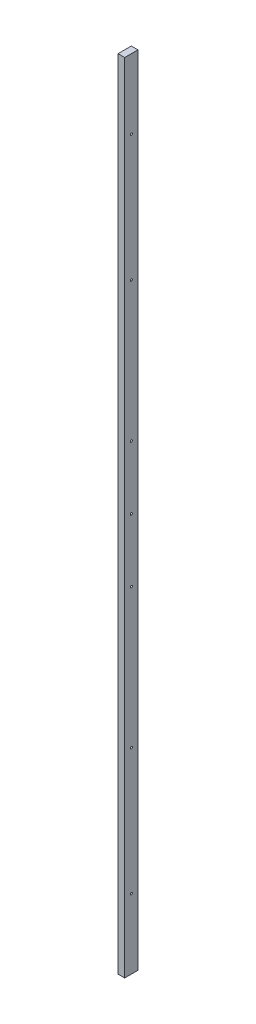
ISO-10303-21;
HEADER;
FILE_DESCRIPTION(('STEP AP214'),'2;1');
FILE_NAME('part.step','',(''),(''),'','','');
FILE_SCHEMA(('AUTOMOTIVE_DESIGN { 1 0 10303 214 1 1 1 1 }'));
ENDSEC;
DATA;
#1=APPLICATION_CONTEXT('core data for automotive mechanical design processes');
#2=APPLICATION_PROTOCOL_DEFINITION('international standard','automotive_design',2000,#1);
#3=PRODUCT_CONTEXT('',#1,'mechanical');
#4=PRODUCT('Part','Part','',(#3));
#5=PRODUCT_RELATED_PRODUCT_CATEGORY('part','',(#4));
#6=PRODUCT_DEFINITION_FORMATION('','',#4);
#7=PRODUCT_DEFINITION_CONTEXT('part definition',#1,'design');
#8=PRODUCT_DEFINITION('design','',#6,#7);
#9=PRODUCT_DEFINITION_SHAPE('','',#8);
#10=(LENGTH_UNIT() NAMED_UNIT(*) SI_UNIT(.MILLI.,.METRE.));
#11=(NAMED_UNIT(*) PLANE_ANGLE_UNIT() SI_UNIT($,.RADIAN.));
#12=(NAMED_UNIT(*) SI_UNIT($,.STERADIAN.) SOLID_ANGLE_UNIT());
#13=UNCERTAINTY_MEASURE_WITH_UNIT(LENGTH_MEASURE(1.E-05),#10,'distance_accuracy_value','');
#14=(GEOMETRIC_REPRESENTATION_CONTEXT(3) GLOBAL_UNCERTAINTY_ASSIGNED_CONTEXT((#13)) GLOBAL_UNIT_ASSIGNED_CONTEXT((#10,
#11,#12)) REPRESENTATION_CONTEXT('',''));
#15=CARTESIAN_POINT('',(0.,0.,0.));
#16=DIRECTION('',(0.,0.,1.));
#17=DIRECTION('',(1.,0.,0.));
#18=AXIS2_PLACEMENT_3D('',#15,#16,#17);
#19=CARTESIAN_POINT('',(-12.5,3000.,-25.));
#20=DIRECTION('',(1.,0.,0.));
#21=DIRECTION('',(0.,0.,-1.));
#22=AXIS2_PLACEMENT_3D('',#19,#20,#21);
#23=PLANE('',#22);
#24=CARTESIAN_POINT('',(-12.5,1500.,0.));
#25=DIRECTION('',(-1.,0.,0.));
#26=DIRECTION('',(0.,0.,1.));
#27=AXIS2_PLACEMENT_3D('',#24,#25,#26);
#28=CIRCLE('',#27,4.);
#29=CARTESIAN_POINT('',(-12.5,1500.,4.));
#30=VERTEX_POINT('',#29);
#31=EDGE_CURVE('E203',#30,#30,#28,.T.);
#32=ORIENTED_EDGE('',*,*,#31,.F.);
#33=EDGE_LOOP('',(#32));
#34=FACE_BOUND('',#33,.T.);
#35=CARTESIAN_POINT('',(-12.5,1737.5,0.));
#36=DIRECTION('',(-1.,0.,0.));
#37=DIRECTION('',(0.,0.,1.));
#38=AXIS2_PLACEMENT_3D('',#35,#36,#37);
#39=CIRCLE('',#38,4.);
#40=CARTESIAN_POINT('',(-12.5,1737.5,4.00000000000007));
#41=VERTEX_POINT('',#40);
#42=EDGE_CURVE('E138',#41,#41,#39,.T.);
#43=ORIENTED_EDGE('',*,*,#42,.F.);
#44=EDGE_LOOP('',(#43));
#45=FACE_BOUND('',#44,.T.);
#46=CARTESIAN_POINT('',(-12.5,1262.5,0.));
#47=DIRECTION('',(-1.,0.,0.));
#48=DIRECTION('',(0.,0.,1.));
#49=AXIS2_PLACEMENT_3D('',#46,#47,#48);
#50=CIRCLE('',#49,4.);
#51=CARTESIAN_POINT('',(-12.5,1262.5,4.));
#52=VERTEX_POINT('',#51);
#53=EDGE_CURVE('E150',#52,#52,#50,.T.);
#54=ORIENTED_EDGE('',*,*,#53,.F.);
#55=EDGE_LOOP('',(#54));
#56=FACE_BOUND('',#55,.T.);
#57=CARTESIAN_POINT('',(-12.5,2262.5,0.));
#58=DIRECTION('',(-1.,0.,0.));
#59=DIRECTION('',(0.,0.,1.));
#60=AXIS2_PLACEMENT_3D('',#57,#58,#59);
#61=CIRCLE('',#60,4.);
#62=CARTESIAN_POINT('',(-12.5,2262.5,4.00000000000006));
#63=VERTEX_POINT('',#62);
#64=EDGE_CURVE('E133',#63,#63,#61,.T.);
#65=ORIENTED_EDGE('',*,*,#64,.F.);
#66=EDGE_LOOP('',(#65));
#67=FACE_BOUND('',#66,.T.);
#68=CARTESIAN_POINT('',(-12.5000000000002,2737.5,0.));
#69=DIRECTION('',(1.,0.,0.));
#70=DIRECTION('',(0.,0.,-1.));
#71=AXIS2_PLACEMENT_3D('',#68,#69,#70);
#72=CIRCLE('',#71,4.);
#73=CARTESIAN_POINT('',(-12.5000000000002,2737.5,-4.00000000000004));
#74=VERTEX_POINT('',#73);
#75=EDGE_CURVE('E117',#74,#74,#72,.T.);
#76=ORIENTED_EDGE('',*,*,#75,.T.);
#77=EDGE_LOOP('',(#76));
#78=FACE_BOUND('',#77,.T.);
#79=CARTESIAN_POINT('',(-12.5000000000002,262.5,0.));
#80=DIRECTION('',(1.,0.,0.));
#81=DIRECTION('',(0.,0.,-1.));
#82=AXIS2_PLACEMENT_3D('',#79,#80,#81);
#83=CIRCLE('',#82,4.);
#84=CARTESIAN_POINT('',(-12.5000000000002,262.5,-4.));
#85=VERTEX_POINT('',#84);
#86=EDGE_CURVE('E167',#85,#85,#83,.T.);
#87=ORIENTED_EDGE('',*,*,#86,.T.);
#88=EDGE_LOOP('',(#87));
#89=FACE_BOUND('',#88,.T.);
#90=CARTESIAN_POINT('',(-12.5000000000002,737.5,0.));
#91=DIRECTION('',(1.,0.,0.));
#92=DIRECTION('',(0.,0.,-1.));
#93=AXIS2_PLACEMENT_3D('',#90,#91,#92);
#94=CIRCLE('',#93,4.);
#95=CARTESIAN_POINT('',(-12.5000000000002,737.5,-4.));
#96=VERTEX_POINT('',#95);
#97=EDGE_CURVE('E156',#96,#96,#94,.T.);
#98=ORIENTED_EDGE('',*,*,#97,.T.);
#99=EDGE_LOOP('',(#98));
#100=FACE_BOUND('',#99,.T.);
#101=DIRECTION('',(0.,0.,1.));
#102=VECTOR('',#101,1.);
#103=CARTESIAN_POINT('',(-12.5,0.,-25.));
#104=LINE('',#103,#102);
#105=CARTESIAN_POINT('',(-12.5,0.,-25.));
#106=VERTEX_POINT('',#105);
#107=CARTESIAN_POINT('',(-12.5,0.,25.));
#108=VERTEX_POINT('',#107);
#109=EDGE_CURVE('E113',#106,#108,#104,.T.);
#110=ORIENTED_EDGE('',*,*,#109,.T.);
#111=DIRECTION('',(0.,-1.,0.));
#112=VECTOR('',#111,1.);
#113=CARTESIAN_POINT('',(-12.5,3000.,25.));
#114=LINE('',#113,#112);
#115=CARTESIAN_POINT('',(-12.5,3000.,25.));
#116=VERTEX_POINT('',#115);
#117=EDGE_CURVE('E11',#116,#108,#114,.T.);
#118=ORIENTED_EDGE('',*,*,#117,.F.);
#119=DIRECTION('',(0.,0.,1.));
#120=VECTOR('',#119,1.);
#121=CARTESIAN_POINT('',(-12.5,3000.,-25.));
#122=LINE('',#121,#120);
#123=CARTESIAN_POINT('',(-12.5,3000.,-25.));
#124=VERTEX_POINT('',#123);
#125=EDGE_CURVE('E96',#124,#116,#122,.T.);
#126=ORIENTED_EDGE('',*,*,#125,.F.);
#127=DIRECTION('',(0.,-1.,0.));
#128=VECTOR('',#127,1.);
#129=CARTESIAN_POINT('',(-12.5,3000.,-25.));
#130=LINE('',#129,#128);
#131=EDGE_CURVE('E109',#124,#106,#130,.T.);
#132=ORIENTED_EDGE('',*,*,#131,.T.);
#133=EDGE_LOOP('',(#110,#118,#126,#132));
#134=FACE_BOUND('',#133,.T.);
#135=ADVANCED_FACE('F42',(#34,#45,#56,#67,#78,#89,#100,#134),#23,.F.);
#136=CARTESIAN_POINT('',(12.5,3000.,25.));
#137=DIRECTION('',(0.,0.,-1.));
#138=DIRECTION('',(-1.,0.,0.));
#139=AXIS2_PLACEMENT_3D('',#136,#137,#138);
#140=PLANE('',#139);
#141=DIRECTION('',(1.,0.,0.));
#142=VECTOR('',#141,1.);
#143=CARTESIAN_POINT('',(12.5,0.,25.));
#144=LINE('',#143,#142);
#145=CARTESIAN_POINT('',(12.5,0.,25.));
#146=VERTEX_POINT('',#145);
#147=EDGE_CURVE('E101',#108,#146,#144,.T.);
#148=ORIENTED_EDGE('',*,*,#147,.T.);
#149=DIRECTION('',(0.,-1.,0.));
#150=VECTOR('',#149,1.);
#151=CARTESIAN_POINT('',(12.5,3000.,25.));
#152=LINE('',#151,#150);
#153=CARTESIAN_POINT('',(12.5,3000.,25.));
#154=VERTEX_POINT('',#153);
#155=EDGE_CURVE('E52',#154,#146,#152,.T.);
#156=ORIENTED_EDGE('',*,*,#155,.F.);
#157=DIRECTION('',(1.,0.,0.));
#158=VECTOR('',#157,1.);
#159=CARTESIAN_POINT('',(12.5,3000.,25.));
#160=LINE('',#159,#158);
#161=EDGE_CURVE('E91',#116,#154,#160,.T.);
#162=ORIENTED_EDGE('',*,*,#161,.F.);
#163=ORIENTED_EDGE('',*,*,#117,.T.);
#164=EDGE_LOOP('',(#148,#156,#162,#163));
#165=FACE_BOUND('',#164,.T.);
#166=ADVANCED_FACE('F100',(#165),#140,.F.);
#167=CARTESIAN_POINT('',(12.5,3000.,-25.));
#168=DIRECTION('',(-1.,0.,0.));
#169=DIRECTION('',(0.,0.,1.));
#170=AXIS2_PLACEMENT_3D('',#167,#168,#169);
#171=PLANE('',#170);
#172=CARTESIAN_POINT('',(12.5,1500.,0.));
#173=DIRECTION('',(-1.,0.,0.));
#174=DIRECTION('',(0.,0.,1.));
#175=AXIS2_PLACEMENT_3D('',#172,#173,#174);
#176=CIRCLE('',#175,4.);
#177=CARTESIAN_POINT('',(12.5,1500.,4.));
#178=VERTEX_POINT('',#177);
#179=EDGE_CURVE('E45',#178,#178,#176,.T.);
#180=ORIENTED_EDGE('',*,*,#179,.T.);
#181=EDGE_LOOP('',(#180));
#182=FACE_BOUND('',#181,.T.);
#183=CARTESIAN_POINT('',(12.5000000000002,1737.5,0.));
#184=DIRECTION('',(-1.,0.,0.));
#185=DIRECTION('',(0.,0.,1.));
#186=AXIS2_PLACEMENT_3D('',#183,#184,#185);
#187=CIRCLE('',#186,4.);
#188=CARTESIAN_POINT('',(12.5000000000002,1737.5,4.00000000000007));
#189=VERTEX_POINT('',#188);
#190=EDGE_CURVE('E137',#189,#189,#187,.T.);
#191=ORIENTED_EDGE('',*,*,#190,.T.);
#192=EDGE_LOOP('',(#191));
#193=FACE_BOUND('',#192,.T.);
#194=CARTESIAN_POINT('',(12.5000000000002,1262.5,0.));
#195=DIRECTION('',(-1.,0.,0.));
#196=DIRECTION('',(0.,0.,1.));
#197=AXIS2_PLACEMENT_3D('',#194,#195,#196);
#198=CIRCLE('',#197,4.);
#199=CARTESIAN_POINT('',(12.5000000000002,1262.5,4.));
#200=VERTEX_POINT('',#199);
#201=EDGE_CURVE('E134',#200,#200,#198,.T.);
#202=ORIENTED_EDGE('',*,*,#201,.T.);
#203=EDGE_LOOP('',(#202));
#204=FACE_BOUND('',#203,.T.);
#205=CARTESIAN_POINT('',(12.5000000000002,2262.5,0.));
#206=DIRECTION('',(-1.,0.,0.));
#207=DIRECTION('',(0.,0.,1.));
#208=AXIS2_PLACEMENT_3D('',#205,#206,#207);
#209=CIRCLE('',#208,4.);
#210=CARTESIAN_POINT('',(12.5000000000002,2262.5,4.00000000000006));
#211=VERTEX_POINT('',#210);
#212=EDGE_CURVE('E128',#211,#211,#209,.T.);
#213=ORIENTED_EDGE('',*,*,#212,.T.);
#214=EDGE_LOOP('',(#213));
#215=FACE_BOUND('',#214,.T.);
#216=CARTESIAN_POINT('',(12.5,2737.5,0.));
#217=DIRECTION('',(1.,0.,0.));
#218=DIRECTION('',(0.,0.,-1.));
#219=AXIS2_PLACEMENT_3D('',#216,#217,#218);
#220=CIRCLE('',#219,4.);
#221=CARTESIAN_POINT('',(12.5,2737.5,-4.00000000000004));
#222=VERTEX_POINT('',#221);
#223=EDGE_CURVE('E152',#222,#222,#220,.T.);
#224=ORIENTED_EDGE('',*,*,#223,.F.);
#225=EDGE_LOOP('',(#224));
#226=FACE_BOUND('',#225,.T.);
#227=CARTESIAN_POINT('',(12.5,262.5,0.));
#228=DIRECTION('',(1.,0.,0.));
#229=DIRECTION('',(0.,0.,-1.));
#230=AXIS2_PLACEMENT_3D('',#227,#228,#229);
#231=CIRCLE('',#230,4.);
#232=CARTESIAN_POINT('',(12.5,262.5,-4.));
#233=VERTEX_POINT('',#232);
#234=EDGE_CURVE('E157',#233,#233,#231,.T.);
#235=ORIENTED_EDGE('',*,*,#234,.F.);
#236=EDGE_LOOP('',(#235));
#237=FACE_BOUND('',#236,.T.);
#238=CARTESIAN_POINT('',(12.5,737.5,0.));
#239=DIRECTION('',(1.,0.,0.));
#240=DIRECTION('',(0.,0.,-1.));
#241=AXIS2_PLACEMENT_3D('',#238,#239,#240);
#242=CIRCLE('',#241,4.);
#243=CARTESIAN_POINT('',(12.5,737.5,-4.));
#244=VERTEX_POINT('',#243);
#245=EDGE_CURVE('E132',#244,#244,#242,.T.);
#246=ORIENTED_EDGE('',*,*,#245,.F.);
#247=EDGE_LOOP('',(#246));
#248=FACE_BOUND('',#247,.T.);
#249=DIRECTION('',(0.,0.,-1.));
#250=VECTOR('',#249,1.);
#251=CARTESIAN_POINT('',(12.5,0.,-25.));
#252=LINE('',#251,#250);
#253=CARTESIAN_POINT('',(12.5,0.,-25.));
#254=VERTEX_POINT('',#253);
#255=EDGE_CURVE('E78',#146,#254,#252,.T.);
#256=ORIENTED_EDGE('',*,*,#255,.T.);
#257=DIRECTION('',(0.,-1.,0.));
#258=VECTOR('',#257,1.);
#259=CARTESIAN_POINT('',(12.5,3000.,-25.));
#260=LINE('',#259,#258);
#261=CARTESIAN_POINT('',(12.5,3000.,-25.));
#262=VERTEX_POINT('',#261);
#263=EDGE_CURVE('E103',#262,#254,#260,.T.);
#264=ORIENTED_EDGE('',*,*,#263,.F.);
#265=DIRECTION('',(0.,0.,-1.));
#266=VECTOR('',#265,1.);
#267=CARTESIAN_POINT('',(12.5,3000.,-25.));
#268=LINE('',#267,#266);
#269=EDGE_CURVE('E94',#154,#262,#268,.T.);
#270=ORIENTED_EDGE('',*,*,#269,.F.);
#271=ORIENTED_EDGE('',*,*,#155,.T.);
#272=EDGE_LOOP('',(#256,#264,#270,#271));
#273=FACE_BOUND('',#272,.T.);
#274=ADVANCED_FACE('F105',(#182,#193,#204,#215,#226,#237,#248,#273),#171,.F.);
#275=CARTESIAN_POINT('',(12.5,3000.,-25.));
#276=DIRECTION('',(0.,0.,1.));
#277=DIRECTION('',(1.,0.,0.));
#278=AXIS2_PLACEMENT_3D('',#275,#276,#277);
#279=PLANE('',#278);
#280=DIRECTION('',(-1.,0.,0.));
#281=VECTOR('',#280,1.);
#282=CARTESIAN_POINT('',(12.5,0.,-25.));
#283=LINE('',#282,#281);
#284=EDGE_CURVE('E84',#254,#106,#283,.T.);
#285=ORIENTED_EDGE('',*,*,#284,.T.);
#286=ORIENTED_EDGE('',*,*,#131,.F.);
#287=DIRECTION('',(-1.,0.,0.));
#288=VECTOR('',#287,1.);
#289=CARTESIAN_POINT('',(12.5,3000.,-25.));
#290=LINE('',#289,#288);
#291=EDGE_CURVE('E61',#262,#124,#290,.T.);
#292=ORIENTED_EDGE('',*,*,#291,.F.);
#293=ORIENTED_EDGE('',*,*,#263,.T.);
#294=EDGE_LOOP('',(#285,#286,#292,#293));
#295=FACE_BOUND('',#294,.T.);
#296=ADVANCED_FACE('F238',(#295),#279,.F.);
#297=CARTESIAN_POINT('',(0.,3000.,0.));
#298=DIRECTION('',(0.,-1.,0.));
#299=DIRECTION('',(0.,0.,-1.));
#300=AXIS2_PLACEMENT_3D('',#297,#298,#299);
#301=PLANE('',#300);
#302=ORIENTED_EDGE('',*,*,#125,.T.);
#303=ORIENTED_EDGE('',*,*,#161,.T.);
#304=ORIENTED_EDGE('',*,*,#269,.T.);
#305=ORIENTED_EDGE('',*,*,#291,.T.);
#306=EDGE_LOOP('',(#302,#303,#304,#305));
#307=FACE_BOUND('',#306,.T.);
#308=ADVANCED_FACE('F92',(#307),#301,.F.);
#309=CARTESIAN_POINT('',(0.,0.,0.));
#310=DIRECTION('',(0.,-1.,0.));
#311=DIRECTION('',(0.,0.,-1.));
#312=AXIS2_PLACEMENT_3D('',#309,#310,#311);
#313=PLANE('',#312);
#314=ORIENTED_EDGE('',*,*,#109,.F.);
#315=ORIENTED_EDGE('',*,*,#284,.F.);
#316=ORIENTED_EDGE('',*,*,#255,.F.);
#317=ORIENTED_EDGE('',*,*,#147,.F.);
#318=EDGE_LOOP('',(#314,#315,#316,#317));
#319=FACE_BOUND('',#318,.T.);
#320=ADVANCED_FACE('F250',(#319),#313,.T.);
#321=CARTESIAN_POINT('',(-2987.5,737.5,0.));
#322=DIRECTION('',(1.,0.,0.));
#323=DIRECTION('',(0.,0.,-1.));
#324=AXIS2_PLACEMENT_3D('',#321,#322,#323);
#325=CYLINDRICAL_SURFACE('',#324,4.);
#326=ORIENTED_EDGE('',*,*,#245,.T.);
#327=EDGE_LOOP('',(#326));
#328=FACE_BOUND('',#327,.T.);
#329=ORIENTED_EDGE('',*,*,#97,.F.);
#330=EDGE_LOOP('',(#329));
#331=FACE_BOUND('',#330,.T.);
#332=ADVANCED_FACE('F190',(#328,#331),#325,.F.);
#333=CARTESIAN_POINT('',(-2987.5,262.5,0.));
#334=DIRECTION('',(1.,0.,0.));
#335=DIRECTION('',(0.,0.,-1.));
#336=AXIS2_PLACEMENT_3D('',#333,#334,#335);
#337=CYLINDRICAL_SURFACE('',#336,4.);
#338=ORIENTED_EDGE('',*,*,#234,.T.);
#339=EDGE_LOOP('',(#338));
#340=FACE_BOUND('',#339,.T.);
#341=ORIENTED_EDGE('',*,*,#86,.F.);
#342=EDGE_LOOP('',(#341));
#343=FACE_BOUND('',#342,.T.);
#344=ADVANCED_FACE('F181',(#340,#343),#337,.F.);
#345=CARTESIAN_POINT('',(-2987.5,2737.5,0.));
#346=DIRECTION('',(1.,0.,0.));
#347=DIRECTION('',(0.,0.,-1.));
#348=AXIS2_PLACEMENT_3D('',#345,#346,#347);
#349=CYLINDRICAL_SURFACE('',#348,4.);
#350=ORIENTED_EDGE('',*,*,#223,.T.);
#351=EDGE_LOOP('',(#350));
#352=FACE_BOUND('',#351,.T.);
#353=ORIENTED_EDGE('',*,*,#75,.F.);
#354=EDGE_LOOP('',(#353));
#355=FACE_BOUND('',#354,.T.);
#356=ADVANCED_FACE('F178',(#352,#355),#349,.F.);
#357=CARTESIAN_POINT('',(2987.5,2262.5,0.));
#358=DIRECTION('',(-1.,0.,0.));
#359=DIRECTION('',(0.,0.,1.));
#360=AXIS2_PLACEMENT_3D('',#357,#358,#359);
#361=CYLINDRICAL_SURFACE('',#360,4.);
#362=ORIENTED_EDGE('',*,*,#64,.T.);
#363=EDGE_LOOP('',(#362));
#364=FACE_BOUND('',#363,.T.);
#365=ORIENTED_EDGE('',*,*,#212,.F.);
#366=EDGE_LOOP('',(#365));
#367=FACE_BOUND('',#366,.T.);
#368=ADVANCED_FACE('F180',(#364,#367),#361,.F.);
#369=CARTESIAN_POINT('',(2987.5,1262.5,0.));
#370=DIRECTION('',(-1.,0.,0.));
#371=DIRECTION('',(0.,0.,1.));
#372=AXIS2_PLACEMENT_3D('',#369,#370,#371);
#373=CYLINDRICAL_SURFACE('',#372,4.);
#374=ORIENTED_EDGE('',*,*,#53,.T.);
#375=EDGE_LOOP('',(#374));
#376=FACE_BOUND('',#375,.T.);
#377=ORIENTED_EDGE('',*,*,#201,.F.);
#378=EDGE_LOOP('',(#377));
#379=FACE_BOUND('',#378,.T.);
#380=ADVANCED_FACE('F188',(#376,#379),#373,.F.);
#381=CARTESIAN_POINT('',(2987.5,1737.5,0.));
#382=DIRECTION('',(-1.,0.,0.));
#383=DIRECTION('',(0.,0.,1.));
#384=AXIS2_PLACEMENT_3D('',#381,#382,#383);
#385=CYLINDRICAL_SURFACE('',#384,4.);
#386=ORIENTED_EDGE('',*,*,#42,.T.);
#387=EDGE_LOOP('',(#386));
#388=FACE_BOUND('',#387,.T.);
#389=ORIENTED_EDGE('',*,*,#190,.F.);
#390=EDGE_LOOP('',(#389));
#391=FACE_BOUND('',#390,.T.);
#392=ADVANCED_FACE('F223',(#388,#391),#385,.F.);
#393=CARTESIAN_POINT('',(37.5,1500.,0.));
#394=DIRECTION('',(-1.,0.,0.));
#395=DIRECTION('',(0.,0.,1.));
#396=AXIS2_PLACEMENT_3D('',#393,#394,#395);
#397=CYLINDRICAL_SURFACE('',#396,4.);
#398=ORIENTED_EDGE('',*,*,#31,.T.);
#399=EDGE_LOOP('',(#398));
#400=FACE_BOUND('',#399,.T.);
#401=ORIENTED_EDGE('',*,*,#179,.F.);
#402=EDGE_LOOP('',(#401));
#403=FACE_BOUND('',#402,.T.);
#404=ADVANCED_FACE('F220',(#400,#403),#397,.F.);
#405=CLOSED_SHELL('',(#135,#166,#274,#296,#308,#320,#332,#344,#356,#368,#380,#392,#404));
#406=MANIFOLD_SOLID_BREP('B2',#405);
#407=ADVANCED_BREP_SHAPE_REPRESENTATION('',(#18,#406),#14);
#408=SHAPE_DEFINITION_REPRESENTATION(#9,#407);
ENDSEC;
END-ISO-10303-21;
